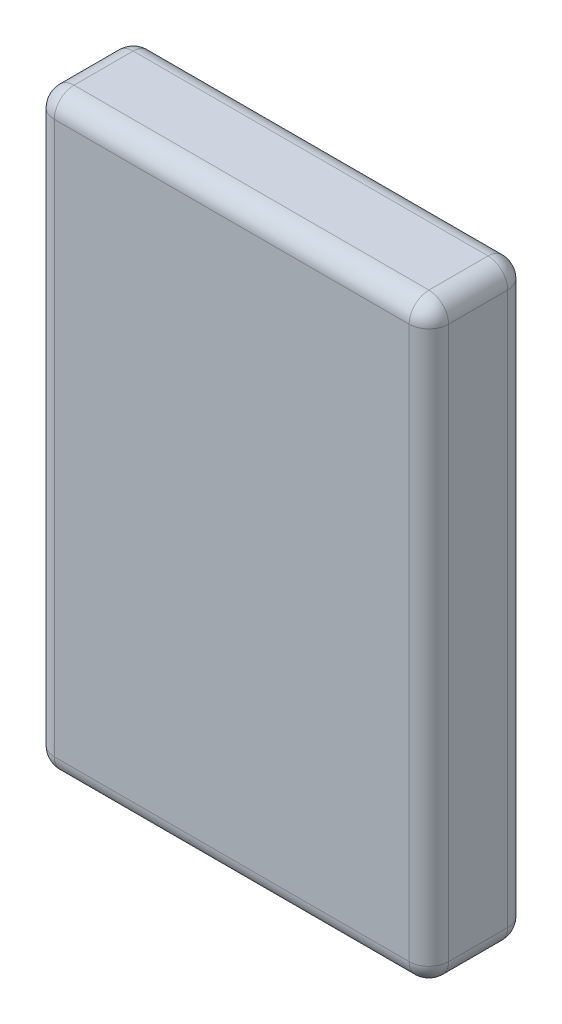
ISO-10303-21;
HEADER;
FILE_DESCRIPTION(('STEP AP214'),'2;1');
FILE_NAME('part.step','',(''),(''),'','','');
FILE_SCHEMA(('AUTOMOTIVE_DESIGN { 1 0 10303 214 1 1 1 1 }'));
ENDSEC;
DATA;
#1=APPLICATION_CONTEXT('core data for automotive mechanical design processes');
#2=APPLICATION_PROTOCOL_DEFINITION('international standard','automotive_design',2000,#1);
#3=PRODUCT_CONTEXT('',#1,'mechanical');
#4=PRODUCT('Part','Part','',(#3));
#5=PRODUCT_RELATED_PRODUCT_CATEGORY('part','',(#4));
#6=PRODUCT_DEFINITION_FORMATION('','',#4);
#7=PRODUCT_DEFINITION_CONTEXT('part definition',#1,'design');
#8=PRODUCT_DEFINITION('design','',#6,#7);
#9=PRODUCT_DEFINITION_SHAPE('','',#8);
#10=(LENGTH_UNIT() NAMED_UNIT(*) SI_UNIT(.MILLI.,.METRE.));
#11=(NAMED_UNIT(*) PLANE_ANGLE_UNIT() SI_UNIT($,.RADIAN.));
#12=(NAMED_UNIT(*) SI_UNIT($,.STERADIAN.) SOLID_ANGLE_UNIT());
#13=UNCERTAINTY_MEASURE_WITH_UNIT(LENGTH_MEASURE(1.E-05),#10,'distance_accuracy_value','');
#14=(GEOMETRIC_REPRESENTATION_CONTEXT(3) GLOBAL_UNCERTAINTY_ASSIGNED_CONTEXT((#13)) GLOBAL_UNIT_ASSIGNED_CONTEXT((#10,
#11,#12)) REPRESENTATION_CONTEXT('',''));
#15=CARTESIAN_POINT('',(0.,0.,0.));
#16=DIRECTION('',(0.,0.,1.));
#17=DIRECTION('',(1.,0.,0.));
#18=AXIS2_PLACEMENT_3D('',#15,#16,#17);
#19=CARTESIAN_POINT('',(2.,-3.,1.));
#20=DIRECTION('',(-1.,0.,0.));
#21=DIRECTION('',(0.,0.,1.));
#22=AXIS2_PLACEMENT_3D('',#19,#20,#21);
#23=PLANE('',#22);
#24=DIRECTION('',(0.,1.,0.));
#25=VECTOR('',#24,1.);
#26=CARTESIAN_POINT('',(2.,3.,0.2));
#27=LINE('',#26,#25);
#28=CARTESIAN_POINT('',(2.,-2.8,0.2));
#29=VERTEX_POINT('',#28);
#30=CARTESIAN_POINT('',(2.,2.8,0.2));
#31=VERTEX_POINT('',#30);
#32=EDGE_CURVE('E194',#29,#31,#27,.T.);
#33=ORIENTED_EDGE('',*,*,#32,.T.);
#34=DIRECTION('',(0.,0.,-1.));
#35=VECTOR('',#34,1.);
#36=CARTESIAN_POINT('',(2.,2.8,1.));
#37=LINE('',#36,#35);
#38=CARTESIAN_POINT('',(2.,2.8,0.8));
#39=VERTEX_POINT('',#38);
#40=EDGE_CURVE('E197',#31,#39,#37,.F.);
#41=ORIENTED_EDGE('',*,*,#40,.T.);
#42=DIRECTION('',(0.,1.,0.));
#43=VECTOR('',#42,1.);
#44=CARTESIAN_POINT('',(2.,-3.,0.8));
#45=LINE('',#44,#43);
#46=CARTESIAN_POINT('',(2.,-2.8,0.8));
#47=VERTEX_POINT('',#46);
#48=EDGE_CURVE('E192',#39,#47,#45,.F.);
#49=ORIENTED_EDGE('',*,*,#48,.T.);
#50=DIRECTION('',(0.,0.,-1.));
#51=VECTOR('',#50,1.);
#52=CARTESIAN_POINT('',(2.,-2.8,1.));
#53=LINE('',#52,#51);
#54=EDGE_CURVE('E190',#47,#29,#53,.T.);
#55=ORIENTED_EDGE('',*,*,#54,.T.);
#56=EDGE_LOOP('',(#33,#41,#49,#55));
#57=FACE_BOUND('',#56,.T.);
#58=ADVANCED_FACE('F35',(#57),#23,.F.);
#59=CARTESIAN_POINT('',(-2.,3.,1.));
#60=DIRECTION('',(0.,-1.,0.));
#61=DIRECTION('',(0.,0.,-1.));
#62=AXIS2_PLACEMENT_3D('',#59,#60,#61);
#63=PLANE('',#62);
#64=DIRECTION('',(-1.,0.,0.));
#65=VECTOR('',#64,1.);
#66=CARTESIAN_POINT('',(-2.,3.,0.2));
#67=LINE('',#66,#65);
#68=CARTESIAN_POINT('',(1.8,3.,0.2));
#69=VERTEX_POINT('',#68);
#70=CARTESIAN_POINT('',(-1.8,3.,0.2));
#71=VERTEX_POINT('',#70);
#72=EDGE_CURVE('E134',#69,#71,#67,.T.);
#73=ORIENTED_EDGE('',*,*,#72,.T.);
#74=DIRECTION('',(0.,0.,-1.));
#75=VECTOR('',#74,1.);
#76=CARTESIAN_POINT('',(-1.8,3.,1.));
#77=LINE('',#76,#75);
#78=CARTESIAN_POINT('',(-1.8,3.,0.8));
#79=VERTEX_POINT('',#78);
#80=EDGE_CURVE('E130',#71,#79,#77,.F.);
#81=ORIENTED_EDGE('',*,*,#80,.T.);
#82=DIRECTION('',(-1.,0.,0.));
#83=VECTOR('',#82,1.);
#84=CARTESIAN_POINT('',(-2.,3.,0.8));
#85=LINE('',#84,#83);
#86=CARTESIAN_POINT('',(1.8,3.,0.8));
#87=VERTEX_POINT('',#86);
#88=EDGE_CURVE('E122',#79,#87,#85,.F.);
#89=ORIENTED_EDGE('',*,*,#88,.T.);
#90=DIRECTION('',(0.,0.,-1.));
#91=VECTOR('',#90,1.);
#92=CARTESIAN_POINT('',(1.8,3.,1.));
#93=LINE('',#92,#91);
#94=EDGE_CURVE('E127',#87,#69,#93,.T.);
#95=ORIENTED_EDGE('',*,*,#94,.T.);
#96=EDGE_LOOP('',(#73,#81,#89,#95));
#97=FACE_BOUND('',#96,.T.);
#98=ADVANCED_FACE('F125',(#97),#63,.F.);
#99=CARTESIAN_POINT('',(-2.,-3.,1.));
#100=DIRECTION('',(1.,0.,0.));
#101=DIRECTION('',(0.,0.,-1.));
#102=AXIS2_PLACEMENT_3D('',#99,#100,#101);
#103=PLANE('',#102);
#104=DIRECTION('',(0.,-1.,0.));
#105=VECTOR('',#104,1.);
#106=CARTESIAN_POINT('',(-2.,-3.,0.8));
#107=LINE('',#106,#105);
#108=CARTESIAN_POINT('',(-2.,-2.8,0.8));
#109=VERTEX_POINT('',#108);
#110=CARTESIAN_POINT('',(-2.,2.8,0.8));
#111=VERTEX_POINT('',#110);
#112=EDGE_CURVE('E174',#109,#111,#107,.F.);
#113=ORIENTED_EDGE('',*,*,#112,.T.);
#114=DIRECTION('',(0.,0.,-1.));
#115=VECTOR('',#114,1.);
#116=CARTESIAN_POINT('',(-2.,2.8,1.));
#117=LINE('',#116,#115);
#118=CARTESIAN_POINT('',(-2.,2.8,0.2));
#119=VERTEX_POINT('',#118);
#120=EDGE_CURVE('E179',#111,#119,#117,.T.);
#121=ORIENTED_EDGE('',*,*,#120,.T.);
#122=DIRECTION('',(0.,-1.,0.));
#123=VECTOR('',#122,1.);
#124=CARTESIAN_POINT('',(-2.,-3.,0.2));
#125=LINE('',#124,#123);
#126=CARTESIAN_POINT('',(-2.,-2.8,0.2));
#127=VERTEX_POINT('',#126);
#128=EDGE_CURVE('E176',#119,#127,#125,.T.);
#129=ORIENTED_EDGE('',*,*,#128,.T.);
#130=DIRECTION('',(0.,0.,-1.));
#131=VECTOR('',#130,1.);
#132=CARTESIAN_POINT('',(-2.,-2.8,1.));
#133=LINE('',#132,#131);
#134=EDGE_CURVE('E172',#127,#109,#133,.F.);
#135=ORIENTED_EDGE('',*,*,#134,.T.);
#136=EDGE_LOOP('',(#113,#121,#129,#135));
#137=FACE_BOUND('',#136,.T.);
#138=ADVANCED_FACE('F265',(#137),#103,.F.);
#139=CARTESIAN_POINT('',(-2.,-3.,1.));
#140=DIRECTION('',(0.,1.,0.));
#141=DIRECTION('',(0.,0.,1.));
#142=AXIS2_PLACEMENT_3D('',#139,#140,#141);
#143=PLANE('',#142);
#144=DIRECTION('',(1.,0.,0.));
#145=VECTOR('',#144,1.);
#146=CARTESIAN_POINT('',(2.,-3.,0.2));
#147=LINE('',#146,#145);
#148=CARTESIAN_POINT('',(-1.8,-3.,0.2));
#149=VERTEX_POINT('',#148);
#150=CARTESIAN_POINT('',(1.8,-3.,0.2));
#151=VERTEX_POINT('',#150);
#152=EDGE_CURVE('E185',#149,#151,#147,.T.);
#153=ORIENTED_EDGE('',*,*,#152,.T.);
#154=DIRECTION('',(0.,0.,-1.));
#155=VECTOR('',#154,1.);
#156=CARTESIAN_POINT('',(1.8,-3.,1.));
#157=LINE('',#156,#155);
#158=CARTESIAN_POINT('',(1.8,-3.,0.8));
#159=VERTEX_POINT('',#158);
#160=EDGE_CURVE('E188',#151,#159,#157,.F.);
#161=ORIENTED_EDGE('',*,*,#160,.T.);
#162=DIRECTION('',(1.,0.,0.));
#163=VECTOR('',#162,1.);
#164=CARTESIAN_POINT('',(-2.,-3.,0.8));
#165=LINE('',#164,#163);
#166=CARTESIAN_POINT('',(-1.8,-3.,0.8));
#167=VERTEX_POINT('',#166);
#168=EDGE_CURVE('E183',#159,#167,#165,.F.);
#169=ORIENTED_EDGE('',*,*,#168,.T.);
#170=DIRECTION('',(0.,0.,-1.));
#171=VECTOR('',#170,1.);
#172=CARTESIAN_POINT('',(-1.8,-3.,1.));
#173=LINE('',#172,#171);
#174=EDGE_CURVE('E181',#167,#149,#173,.T.);
#175=ORIENTED_EDGE('',*,*,#174,.T.);
#176=EDGE_LOOP('',(#153,#161,#169,#175));
#177=FACE_BOUND('',#176,.T.);
#178=ADVANCED_FACE('F274',(#177),#143,.F.);
#179=CARTESIAN_POINT('',(0.,0.,1.));
#180=DIRECTION('',(0.,0.,-1.));
#181=DIRECTION('',(-1.,0.,0.));
#182=AXIS2_PLACEMENT_3D('',#179,#180,#181);
#183=PLANE('',#182);
#184=DIRECTION('',(0.,-1.,0.));
#185=VECTOR('',#184,1.);
#186=CARTESIAN_POINT('',(-1.8,0.,1.));
#187=LINE('',#186,#185);
#188=CARTESIAN_POINT('',(-1.8,2.8,1.));
#189=VERTEX_POINT('',#188);
#190=CARTESIAN_POINT('',(-1.8,-2.8,1.));
#191=VERTEX_POINT('',#190);
#192=EDGE_CURVE('E44',#189,#191,#187,.T.);
#193=ORIENTED_EDGE('',*,*,#192,.T.);
#194=DIRECTION('',(1.,0.,0.));
#195=VECTOR('',#194,1.);
#196=CARTESIAN_POINT('',(0.,-2.8,1.));
#197=LINE('',#196,#195);
#198=CARTESIAN_POINT('',(1.8,-2.8,1.));
#199=VERTEX_POINT('',#198);
#200=EDGE_CURVE('E11',#191,#199,#197,.T.);
#201=ORIENTED_EDGE('',*,*,#200,.T.);
#202=DIRECTION('',(0.,1.,0.));
#203=VECTOR('',#202,1.);
#204=CARTESIAN_POINT('',(1.8,0.,1.));
#205=LINE('',#204,#203);
#206=CARTESIAN_POINT('',(1.8,2.8,1.));
#207=VERTEX_POINT('',#206);
#208=EDGE_CURVE('E199',#199,#207,#205,.T.);
#209=ORIENTED_EDGE('',*,*,#208,.T.);
#210=DIRECTION('',(-1.,0.,0.));
#211=VECTOR('',#210,1.);
#212=CARTESIAN_POINT('',(0.,2.8,1.));
#213=LINE('',#212,#211);
#214=EDGE_CURVE('E55',#207,#189,#213,.T.);
#215=ORIENTED_EDGE('',*,*,#214,.T.);
#216=EDGE_LOOP('',(#193,#201,#209,#215));
#217=FACE_BOUND('',#216,.T.);
#218=ADVANCED_FACE('F296',(#217),#183,.F.);
#219=CARTESIAN_POINT('',(0.,0.,0.));
#220=DIRECTION('',(0.,0.,-1.));
#221=DIRECTION('',(-1.,0.,0.));
#222=AXIS2_PLACEMENT_3D('',#219,#220,#221);
#223=PLANE('',#222);
#224=DIRECTION('',(0.,-1.,0.));
#225=VECTOR('',#224,1.);
#226=CARTESIAN_POINT('',(-1.8,3.,0.));
#227=LINE('',#226,#225);
#228=CARTESIAN_POINT('',(-1.8,-2.8,0.));
#229=VERTEX_POINT('',#228);
#230=CARTESIAN_POINT('',(-1.8,2.8,0.));
#231=VERTEX_POINT('',#230);
#232=EDGE_CURVE('E167',#229,#231,#227,.F.);
#233=ORIENTED_EDGE('',*,*,#232,.T.);
#234=DIRECTION('',(-1.,0.,0.));
#235=VECTOR('',#234,1.);
#236=CARTESIAN_POINT('',(2.,2.8,0.));
#237=LINE('',#236,#235);
#238=CARTESIAN_POINT('',(1.8,2.8,0.));
#239=VERTEX_POINT('',#238);
#240=EDGE_CURVE('E169',#231,#239,#237,.F.);
#241=ORIENTED_EDGE('',*,*,#240,.T.);
#242=DIRECTION('',(0.,1.,0.));
#243=VECTOR('',#242,1.);
#244=CARTESIAN_POINT('',(1.8,-3.,0.));
#245=LINE('',#244,#243);
#246=CARTESIAN_POINT('',(1.8,-2.8,0.));
#247=VERTEX_POINT('',#246);
#248=EDGE_CURVE('E163',#239,#247,#245,.F.);
#249=ORIENTED_EDGE('',*,*,#248,.T.);
#250=DIRECTION('',(1.,0.,0.));
#251=VECTOR('',#250,1.);
#252=CARTESIAN_POINT('',(-2.,-2.8,0.));
#253=LINE('',#252,#251);
#254=EDGE_CURVE('E165',#247,#229,#253,.F.);
#255=ORIENTED_EDGE('',*,*,#254,.T.);
#256=EDGE_LOOP('',(#233,#241,#249,#255));
#257=FACE_BOUND('',#256,.T.);
#258=ADVANCED_FACE('F298',(#257),#223,.T.);
#259=CARTESIAN_POINT('',(0.,-2.8,0.8));
#260=DIRECTION('',(1.,0.,0.));
#261=DIRECTION('',(0.,0.,-1.));
#262=AXIS2_PLACEMENT_3D('',#259,#260,#261);
#263=CYLINDRICAL_SURFACE('',#262,0.2);
#264=CARTESIAN_POINT('',(1.8,-2.8,0.8));
#265=DIRECTION('',(1.,0.,0.));
#266=DIRECTION('',(0.,0.,-1.));
#267=AXIS2_PLACEMENT_3D('',#264,#265,#266);
#268=CIRCLE('',#267,0.2);
#269=EDGE_CURVE('E39',#199,#159,#268,.T.);
#270=ORIENTED_EDGE('',*,*,#269,.F.);
#271=ORIENTED_EDGE('',*,*,#200,.F.);
#272=CARTESIAN_POINT('',(-1.8,-2.8,0.8));
#273=DIRECTION('',(-1.,0.,0.));
#274=DIRECTION('',(0.,0.,1.));
#275=AXIS2_PLACEMENT_3D('',#272,#273,#274);
#276=CIRCLE('',#275,0.2);
#277=EDGE_CURVE('E159',#167,#191,#276,.T.);
#278=ORIENTED_EDGE('',*,*,#277,.F.);
#279=ORIENTED_EDGE('',*,*,#168,.F.);
#280=EDGE_LOOP('',(#270,#271,#278,#279));
#281=FACE_BOUND('',#280,.T.);
#282=ADVANCED_FACE('F37',(#281),#263,.T.);
#283=CARTESIAN_POINT('',(1.8,-2.8,0.8));
#284=DIRECTION('',(0.,0.,1.));
#285=DIRECTION('',(1.,0.,0.));
#286=AXIS2_PLACEMENT_3D('',#283,#284,#285);
#287=SPHERICAL_SURFACE('',#286,0.2);
#288=CARTESIAN_POINT('',(1.8,-2.8,0.8));
#289=DIRECTION('',(0.,-1.,0.));
#290=DIRECTION('',(0.,0.,-1.));
#291=AXIS2_PLACEMENT_3D('',#288,#289,#290);
#292=CIRCLE('',#291,0.2);
#293=EDGE_CURVE('E245',#199,#47,#292,.F.);
#294=ORIENTED_EDGE('',*,*,#293,.F.);
#295=ORIENTED_EDGE('',*,*,#269,.T.);
#296=CARTESIAN_POINT('',(1.8,-2.8,0.8));
#297=DIRECTION('',(0.,0.,1.));
#298=DIRECTION('',(1.,0.,0.));
#299=AXIS2_PLACEMENT_3D('',#296,#297,#298);
#300=CIRCLE('',#299,0.2);
#301=EDGE_CURVE('E248',#47,#159,#300,.F.);
#302=ORIENTED_EDGE('',*,*,#301,.F.);
#303=EDGE_LOOP('',(#294,#295,#302));
#304=FACE_BOUND('',#303,.T.);
#305=ADVANCED_FACE('F292',(#304),#287,.T.);
#306=CARTESIAN_POINT('',(-1.8,-2.8,0.8));
#307=DIRECTION('',(0.,0.,1.));
#308=DIRECTION('',(1.,0.,0.));
#309=AXIS2_PLACEMENT_3D('',#306,#307,#308);
#310=SPHERICAL_SURFACE('',#309,0.2);
#311=CARTESIAN_POINT('',(-1.8,-2.8,0.8));
#312=DIRECTION('',(0.,0.,1.));
#313=DIRECTION('',(1.,0.,0.));
#314=AXIS2_PLACEMENT_3D('',#311,#312,#313);
#315=CIRCLE('',#314,0.2);
#316=EDGE_CURVE('E239',#167,#109,#315,.F.);
#317=ORIENTED_EDGE('',*,*,#316,.F.);
#318=ORIENTED_EDGE('',*,*,#277,.T.);
#319=CARTESIAN_POINT('',(-1.8,-2.8,0.8));
#320=DIRECTION('',(0.,-1.,0.));
#321=DIRECTION('',(0.,0.,-1.));
#322=AXIS2_PLACEMENT_3D('',#319,#320,#321);
#323=CIRCLE('',#322,0.2);
#324=EDGE_CURVE('E242',#109,#191,#323,.F.);
#325=ORIENTED_EDGE('',*,*,#324,.F.);
#326=EDGE_LOOP('',(#317,#318,#325));
#327=FACE_BOUND('',#326,.T.);
#328=ADVANCED_FACE('F255',(#327),#310,.T.);
#329=CARTESIAN_POINT('',(1.8,-2.8,1.));
#330=DIRECTION('',(0.,0.,-1.));
#331=DIRECTION('',(-1.,0.,0.));
#332=AXIS2_PLACEMENT_3D('',#329,#330,#331);
#333=CYLINDRICAL_SURFACE('',#332,0.2);
#334=ORIENTED_EDGE('',*,*,#301,.T.);
#335=ORIENTED_EDGE('',*,*,#160,.F.);
#336=CARTESIAN_POINT('',(1.8,-2.8,0.2));
#337=DIRECTION('',(0.,0.,-1.));
#338=DIRECTION('',(-1.,0.,0.));
#339=AXIS2_PLACEMENT_3D('',#336,#337,#338);
#340=CIRCLE('',#339,0.2);
#341=EDGE_CURVE('E234',#29,#151,#340,.T.);
#342=ORIENTED_EDGE('',*,*,#341,.F.);
#343=ORIENTED_EDGE('',*,*,#54,.F.);
#344=EDGE_LOOP('',(#334,#335,#342,#343));
#345=FACE_BOUND('',#344,.T.);
#346=ADVANCED_FACE('F286',(#345),#333,.T.);
#347=CARTESIAN_POINT('',(1.8,0.,0.8));
#348=DIRECTION('',(0.,1.,0.));
#349=DIRECTION('',(0.,0.,1.));
#350=AXIS2_PLACEMENT_3D('',#347,#348,#349);
#351=CYLINDRICAL_SURFACE('',#350,0.2);
#352=ORIENTED_EDGE('',*,*,#293,.T.);
#353=ORIENTED_EDGE('',*,*,#48,.F.);
#354=CARTESIAN_POINT('',(1.8,2.8,0.8));
#355=DIRECTION('',(0.,1.,0.));
#356=DIRECTION('',(0.,0.,1.));
#357=AXIS2_PLACEMENT_3D('',#354,#355,#356);
#358=CIRCLE('',#357,0.2);
#359=EDGE_CURVE('E143',#207,#39,#358,.T.);
#360=ORIENTED_EDGE('',*,*,#359,.F.);
#361=ORIENTED_EDGE('',*,*,#208,.F.);
#362=EDGE_LOOP('',(#352,#353,#360,#361));
#363=FACE_BOUND('',#362,.T.);
#364=ADVANCED_FACE('F295',(#363),#351,.T.);
#365=CARTESIAN_POINT('',(0.,2.8,0.8));
#366=DIRECTION('',(-1.,0.,0.));
#367=DIRECTION('',(0.,0.,1.));
#368=AXIS2_PLACEMENT_3D('',#365,#366,#367);
#369=CYLINDRICAL_SURFACE('',#368,0.2);
#370=CARTESIAN_POINT('',(-1.8,2.8,0.8));
#371=DIRECTION('',(-1.,0.,0.));
#372=DIRECTION('',(0.,0.,1.));
#373=AXIS2_PLACEMENT_3D('',#370,#371,#372);
#374=CIRCLE('',#373,0.2);
#375=EDGE_CURVE('E144',#189,#79,#374,.T.);
#376=ORIENTED_EDGE('',*,*,#375,.F.);
#377=ORIENTED_EDGE('',*,*,#214,.F.);
#378=CARTESIAN_POINT('',(1.8,2.8,0.8));
#379=DIRECTION('',(1.,0.,0.));
#380=DIRECTION('',(0.,0.,-1.));
#381=AXIS2_PLACEMENT_3D('',#378,#379,#380);
#382=CIRCLE('',#381,0.2);
#383=EDGE_CURVE('E137',#87,#207,#382,.T.);
#384=ORIENTED_EDGE('',*,*,#383,.F.);
#385=ORIENTED_EDGE('',*,*,#88,.F.);
#386=EDGE_LOOP('',(#376,#377,#384,#385));
#387=FACE_BOUND('',#386,.T.);
#388=ADVANCED_FACE('F139',(#387),#369,.T.);
#389=CARTESIAN_POINT('',(-1.8,0.,0.8));
#390=DIRECTION('',(0.,-1.,0.));
#391=DIRECTION('',(0.,0.,-1.));
#392=AXIS2_PLACEMENT_3D('',#389,#390,#391);
#393=CYLINDRICAL_SURFACE('',#392,0.2);
#394=ORIENTED_EDGE('',*,*,#324,.T.);
#395=ORIENTED_EDGE('',*,*,#192,.F.);
#396=CARTESIAN_POINT('',(-1.8,2.8,0.8));
#397=DIRECTION('',(0.,1.,0.));
#398=DIRECTION('',(0.,0.,1.));
#399=AXIS2_PLACEMENT_3D('',#396,#397,#398);
#400=CIRCLE('',#399,0.2);
#401=EDGE_CURVE('E229',#111,#189,#400,.T.);
#402=ORIENTED_EDGE('',*,*,#401,.F.);
#403=ORIENTED_EDGE('',*,*,#112,.F.);
#404=EDGE_LOOP('',(#394,#395,#402,#403));
#405=FACE_BOUND('',#404,.T.);
#406=ADVANCED_FACE('F261',(#405),#393,.T.);
#407=CARTESIAN_POINT('',(-1.8,-2.8,1.));
#408=DIRECTION('',(0.,0.,-1.));
#409=DIRECTION('',(-1.,0.,0.));
#410=AXIS2_PLACEMENT_3D('',#407,#408,#409);
#411=CYLINDRICAL_SURFACE('',#410,0.2);
#412=ORIENTED_EDGE('',*,*,#316,.T.);
#413=ORIENTED_EDGE('',*,*,#134,.F.);
#414=CARTESIAN_POINT('',(-1.8,-2.8,0.2));
#415=DIRECTION('',(0.,0.,-1.));
#416=DIRECTION('',(-1.,0.,0.));
#417=AXIS2_PLACEMENT_3D('',#414,#415,#416);
#418=CIRCLE('',#417,0.2);
#419=EDGE_CURVE('E226',#149,#127,#418,.T.);
#420=ORIENTED_EDGE('',*,*,#419,.F.);
#421=ORIENTED_EDGE('',*,*,#174,.F.);
#422=EDGE_LOOP('',(#412,#413,#420,#421));
#423=FACE_BOUND('',#422,.T.);
#424=ADVANCED_FACE('F271',(#423),#411,.T.);
#425=CARTESIAN_POINT('',(-2.,-2.8,0.2));
#426=DIRECTION('',(-1.,0.,0.));
#427=DIRECTION('',(0.,0.,1.));
#428=AXIS2_PLACEMENT_3D('',#425,#426,#427);
#429=CYLINDRICAL_SURFACE('',#428,0.2);
#430=CARTESIAN_POINT('',(1.8,-2.8,0.2));
#431=DIRECTION('',(1.,0.,0.));
#432=DIRECTION('',(0.,0.,-1.));
#433=AXIS2_PLACEMENT_3D('',#430,#431,#432);
#434=CIRCLE('',#433,0.2);
#435=EDGE_CURVE('E236',#151,#247,#434,.T.);
#436=ORIENTED_EDGE('',*,*,#435,.F.);
#437=ORIENTED_EDGE('',*,*,#152,.F.);
#438=CARTESIAN_POINT('',(-1.8,-2.8,0.2));
#439=DIRECTION('',(-1.,0.,0.));
#440=DIRECTION('',(0.,0.,1.));
#441=AXIS2_PLACEMENT_3D('',#438,#439,#440);
#442=CIRCLE('',#441,0.2);
#443=EDGE_CURVE('E223',#229,#149,#442,.T.);
#444=ORIENTED_EDGE('',*,*,#443,.F.);
#445=ORIENTED_EDGE('',*,*,#254,.F.);
#446=EDGE_LOOP('',(#436,#437,#444,#445));
#447=FACE_BOUND('',#446,.T.);
#448=ADVANCED_FACE('F278',(#447),#429,.T.);
#449=CARTESIAN_POINT('',(1.8,-2.8,0.2));
#450=DIRECTION('',(0.,0.,1.));
#451=DIRECTION('',(1.,0.,0.));
#452=AXIS2_PLACEMENT_3D('',#449,#450,#451);
#453=SPHERICAL_SURFACE('',#452,0.2);
#454=ORIENTED_EDGE('',*,*,#341,.T.);
#455=ORIENTED_EDGE('',*,*,#435,.T.);
#456=CARTESIAN_POINT('',(1.8,-2.8,0.2));
#457=DIRECTION('',(0.,-1.,0.));
#458=DIRECTION('',(0.,0.,-1.));
#459=AXIS2_PLACEMENT_3D('',#456,#457,#458);
#460=CIRCLE('',#459,0.2);
#461=EDGE_CURVE('E151',#29,#247,#460,.F.);
#462=ORIENTED_EDGE('',*,*,#461,.F.);
#463=EDGE_LOOP('',(#454,#455,#462));
#464=FACE_BOUND('',#463,.T.);
#465=ADVANCED_FACE('F352',(#464),#453,.T.);
#466=CARTESIAN_POINT('',(1.8,2.8,0.8));
#467=DIRECTION('',(0.,0.,1.));
#468=DIRECTION('',(1.,0.,0.));
#469=AXIS2_PLACEMENT_3D('',#466,#467,#468);
#470=SPHERICAL_SURFACE('',#469,0.2);
#471=ORIENTED_EDGE('',*,*,#383,.T.);
#472=ORIENTED_EDGE('',*,*,#359,.T.);
#473=CARTESIAN_POINT('',(1.8,2.8,0.8));
#474=DIRECTION('',(0.,0.,1.));
#475=DIRECTION('',(1.,0.,0.));
#476=AXIS2_PLACEMENT_3D('',#473,#474,#475);
#477=CIRCLE('',#476,0.2);
#478=EDGE_CURVE('E147',#87,#39,#477,.F.);
#479=ORIENTED_EDGE('',*,*,#478,.F.);
#480=EDGE_LOOP('',(#471,#472,#479));
#481=FACE_BOUND('',#480,.T.);
#482=ADVANCED_FACE('F148',(#481),#470,.T.);
#483=CARTESIAN_POINT('',(-1.8,2.8,0.8));
#484=DIRECTION('',(0.,0.,1.));
#485=DIRECTION('',(1.,0.,0.));
#486=AXIS2_PLACEMENT_3D('',#483,#484,#485);
#487=SPHERICAL_SURFACE('',#486,0.2);
#488=ORIENTED_EDGE('',*,*,#401,.T.);
#489=ORIENTED_EDGE('',*,*,#375,.T.);
#490=CARTESIAN_POINT('',(-1.8,2.8,0.8));
#491=DIRECTION('',(0.,0.,1.));
#492=DIRECTION('',(1.,0.,0.));
#493=AXIS2_PLACEMENT_3D('',#490,#491,#492);
#494=CIRCLE('',#493,0.2);
#495=EDGE_CURVE('E152',#111,#79,#494,.F.);
#496=ORIENTED_EDGE('',*,*,#495,.F.);
#497=EDGE_LOOP('',(#488,#489,#496));
#498=FACE_BOUND('',#497,.T.);
#499=ADVANCED_FACE('F345',(#498),#487,.T.);
#500=CARTESIAN_POINT('',(-1.8,-2.8,0.2));
#501=DIRECTION('',(0.,0.,1.));
#502=DIRECTION('',(1.,0.,0.));
#503=AXIS2_PLACEMENT_3D('',#500,#501,#502);
#504=SPHERICAL_SURFACE('',#503,0.2);
#505=ORIENTED_EDGE('',*,*,#443,.T.);
#506=ORIENTED_EDGE('',*,*,#419,.T.);
#507=CARTESIAN_POINT('',(-1.8,-2.8,0.2));
#508=DIRECTION('',(0.,-1.,0.));
#509=DIRECTION('',(0.,0.,-1.));
#510=AXIS2_PLACEMENT_3D('',#507,#508,#509);
#511=CIRCLE('',#510,0.2);
#512=EDGE_CURVE('E217',#229,#127,#511,.F.);
#513=ORIENTED_EDGE('',*,*,#512,.F.);
#514=EDGE_LOOP('',(#505,#506,#513));
#515=FACE_BOUND('',#514,.T.);
#516=ADVANCED_FACE('F341',(#515),#504,.T.);
#517=CARTESIAN_POINT('',(1.8,-3.,0.2));
#518=DIRECTION('',(0.,-1.,0.));
#519=DIRECTION('',(0.,0.,-1.));
#520=AXIS2_PLACEMENT_3D('',#517,#518,#519);
#521=CYLINDRICAL_SURFACE('',#520,0.2);
#522=ORIENTED_EDGE('',*,*,#461,.T.);
#523=ORIENTED_EDGE('',*,*,#248,.F.);
#524=CARTESIAN_POINT('',(1.8,2.8,0.2));
#525=DIRECTION('',(0.,1.,0.));
#526=DIRECTION('',(0.,0.,1.));
#527=AXIS2_PLACEMENT_3D('',#524,#525,#526);
#528=CIRCLE('',#527,0.2);
#529=EDGE_CURVE('E214',#31,#239,#528,.T.);
#530=ORIENTED_EDGE('',*,*,#529,.F.);
#531=ORIENTED_EDGE('',*,*,#32,.F.);
#532=EDGE_LOOP('',(#522,#523,#530,#531));
#533=FACE_BOUND('',#532,.T.);
#534=ADVANCED_FACE('F338',(#533),#521,.T.);
#535=CARTESIAN_POINT('',(1.8,2.8,1.));
#536=DIRECTION('',(0.,0.,-1.));
#537=DIRECTION('',(-1.,0.,0.));
#538=AXIS2_PLACEMENT_3D('',#535,#536,#537);
#539=CYLINDRICAL_SURFACE('',#538,0.2);
#540=ORIENTED_EDGE('',*,*,#478,.T.);
#541=ORIENTED_EDGE('',*,*,#40,.F.);
#542=CARTESIAN_POINT('',(1.8,2.8,0.2));
#543=DIRECTION('',(0.,0.,-1.));
#544=DIRECTION('',(-1.,0.,0.));
#545=AXIS2_PLACEMENT_3D('',#542,#543,#544);
#546=CIRCLE('',#545,0.2);
#547=EDGE_CURVE('E155',#69,#31,#546,.T.);
#548=ORIENTED_EDGE('',*,*,#547,.F.);
#549=ORIENTED_EDGE('',*,*,#94,.F.);
#550=EDGE_LOOP('',(#540,#541,#548,#549));
#551=FACE_BOUND('',#550,.T.);
#552=ADVANCED_FACE('F154',(#551),#539,.T.);
#553=CARTESIAN_POINT('',(-1.8,2.8,1.));
#554=DIRECTION('',(0.,0.,-1.));
#555=DIRECTION('',(-1.,0.,0.));
#556=AXIS2_PLACEMENT_3D('',#553,#554,#555);
#557=CYLINDRICAL_SURFACE('',#556,0.2);
#558=ORIENTED_EDGE('',*,*,#495,.T.);
#559=ORIENTED_EDGE('',*,*,#80,.F.);
#560=CARTESIAN_POINT('',(-1.8,2.8,0.2));
#561=DIRECTION('',(0.,0.,-1.));
#562=DIRECTION('',(-1.,0.,0.));
#563=AXIS2_PLACEMENT_3D('',#560,#561,#562);
#564=CIRCLE('',#563,0.2);
#565=EDGE_CURVE('E210',#119,#71,#564,.T.);
#566=ORIENTED_EDGE('',*,*,#565,.F.);
#567=ORIENTED_EDGE('',*,*,#120,.F.);
#568=EDGE_LOOP('',(#558,#559,#566,#567));
#569=FACE_BOUND('',#568,.T.);
#570=ADVANCED_FACE('F331',(#569),#557,.T.);
#571=CARTESIAN_POINT('',(-1.8,-3.,0.2));
#572=DIRECTION('',(0.,1.,0.));
#573=DIRECTION('',(0.,0.,1.));
#574=AXIS2_PLACEMENT_3D('',#571,#572,#573);
#575=CYLINDRICAL_SURFACE('',#574,0.2);
#576=ORIENTED_EDGE('',*,*,#512,.T.);
#577=ORIENTED_EDGE('',*,*,#128,.F.);
#578=CARTESIAN_POINT('',(-1.8,2.8,0.2));
#579=DIRECTION('',(0.,1.,0.));
#580=DIRECTION('',(-1.,0.,0.));
#581=AXIS2_PLACEMENT_3D('',#578,#579,#580);
#582=CIRCLE('',#581,0.2);
#583=EDGE_CURVE('E207',#231,#119,#582,.T.);
#584=ORIENTED_EDGE('',*,*,#583,.F.);
#585=ORIENTED_EDGE('',*,*,#232,.F.);
#586=EDGE_LOOP('',(#576,#577,#584,#585));
#587=FACE_BOUND('',#586,.T.);
#588=ADVANCED_FACE('F327',(#587),#575,.T.);
#589=CARTESIAN_POINT('',(1.8,2.8,0.2));
#590=DIRECTION('',(0.,0.,1.));
#591=DIRECTION('',(1.,0.,0.));
#592=AXIS2_PLACEMENT_3D('',#589,#590,#591);
#593=SPHERICAL_SURFACE('',#592,0.2);
#594=ORIENTED_EDGE('',*,*,#547,.T.);
#595=ORIENTED_EDGE('',*,*,#529,.T.);
#596=CARTESIAN_POINT('',(1.8,2.8,0.2));
#597=DIRECTION('',(1.,0.,0.));
#598=DIRECTION('',(0.,0.,-1.));
#599=AXIS2_PLACEMENT_3D('',#596,#597,#598);
#600=CIRCLE('',#599,0.2);
#601=EDGE_CURVE('E205',#69,#239,#600,.F.);
#602=ORIENTED_EDGE('',*,*,#601,.F.);
#603=EDGE_LOOP('',(#594,#595,#602));
#604=FACE_BOUND('',#603,.T.);
#605=ADVANCED_FACE('F323',(#604),#593,.T.);
#606=CARTESIAN_POINT('',(-1.8,2.8,0.2));
#607=DIRECTION('',(0.,0.,1.));
#608=DIRECTION('',(1.,0.,0.));
#609=AXIS2_PLACEMENT_3D('',#606,#607,#608);
#610=SPHERICAL_SURFACE('',#609,0.2);
#611=ORIENTED_EDGE('',*,*,#583,.T.);
#612=ORIENTED_EDGE('',*,*,#565,.T.);
#613=CARTESIAN_POINT('',(-1.8,2.8,0.2));
#614=DIRECTION('',(-1.,0.,0.));
#615=DIRECTION('',(0.,0.,1.));
#616=AXIS2_PLACEMENT_3D('',#613,#614,#615);
#617=CIRCLE('',#616,0.2);
#618=EDGE_CURVE('E203',#231,#71,#617,.F.);
#619=ORIENTED_EDGE('',*,*,#618,.F.);
#620=EDGE_LOOP('',(#611,#612,#619));
#621=FACE_BOUND('',#620,.T.);
#622=ADVANCED_FACE('F319',(#621),#610,.T.);
#623=CARTESIAN_POINT('',(-2.,2.8,0.2));
#624=DIRECTION('',(1.,0.,0.));
#625=DIRECTION('',(0.,0.,-1.));
#626=AXIS2_PLACEMENT_3D('',#623,#624,#625);
#627=CYLINDRICAL_SURFACE('',#626,0.2);
#628=ORIENTED_EDGE('',*,*,#601,.T.);
#629=ORIENTED_EDGE('',*,*,#240,.F.);
#630=ORIENTED_EDGE('',*,*,#618,.T.);
#631=ORIENTED_EDGE('',*,*,#72,.F.);
#632=EDGE_LOOP('',(#628,#629,#630,#631));
#633=FACE_BOUND('',#632,.T.);
#634=ADVANCED_FACE('F316',(#633),#627,.T.);
#635=CLOSED_SHELL('',(#58,#98,#138,#178,#218,#258,#282,#305,#328,#346,#364,#388,#406,#424,#448,
#465,#482,#499,#516,#534,#552,#570,#588,#605,#622,#634));
#636=MANIFOLD_SOLID_BREP('B2',#635);
#637=ADVANCED_BREP_SHAPE_REPRESENTATION('',(#18,#636),#14);
#638=SHAPE_DEFINITION_REPRESENTATION(#9,#637);
ENDSEC;
END-ISO-10303-21;
